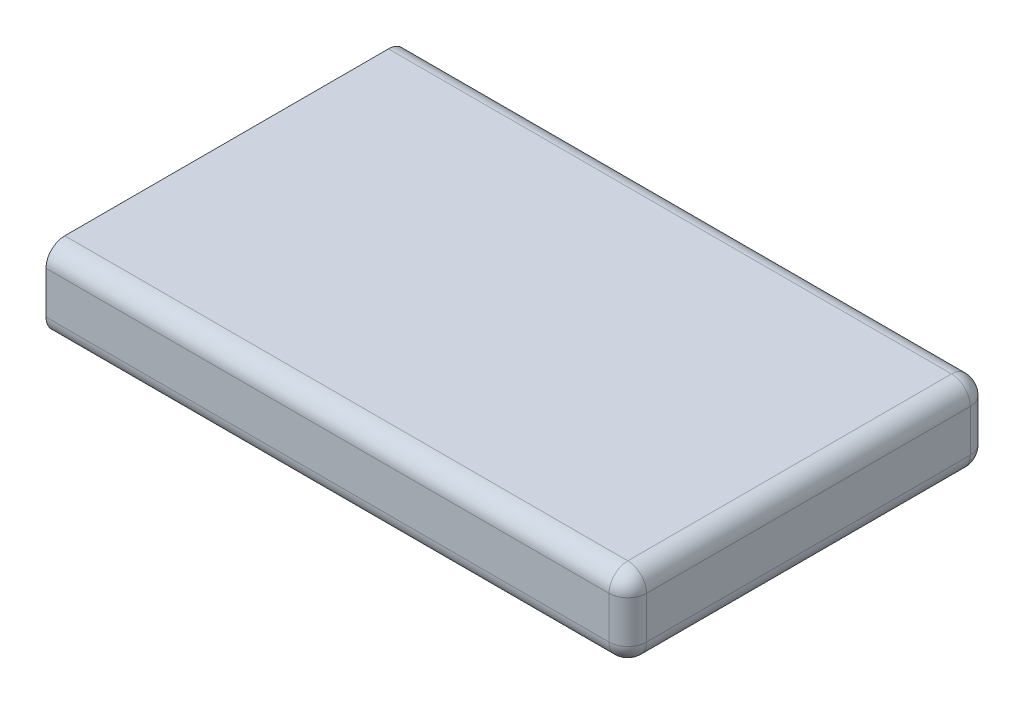
ISO-10303-21;
HEADER;
FILE_DESCRIPTION(('STEP AP214'),'2;1');
FILE_NAME('part.step','',(''),(''),'','','');
FILE_SCHEMA(('AUTOMOTIVE_DESIGN { 1 0 10303 214 1 1 1 1 }'));
ENDSEC;
DATA;
#1=APPLICATION_CONTEXT('core data for automotive mechanical design processes');
#2=APPLICATION_PROTOCOL_DEFINITION('international standard','automotive_design',2000,#1);
#3=PRODUCT_CONTEXT('',#1,'mechanical');
#4=PRODUCT('Part','Part','',(#3));
#5=PRODUCT_RELATED_PRODUCT_CATEGORY('part','',(#4));
#6=PRODUCT_DEFINITION_FORMATION('','',#4);
#7=PRODUCT_DEFINITION_CONTEXT('part definition',#1,'design');
#8=PRODUCT_DEFINITION('design','',#6,#7);
#9=PRODUCT_DEFINITION_SHAPE('','',#8);
#10=(LENGTH_UNIT() NAMED_UNIT(*) SI_UNIT(.MILLI.,.METRE.));
#11=(NAMED_UNIT(*) PLANE_ANGLE_UNIT() SI_UNIT($,.RADIAN.));
#12=(NAMED_UNIT(*) SI_UNIT($,.STERADIAN.) SOLID_ANGLE_UNIT());
#13=UNCERTAINTY_MEASURE_WITH_UNIT(LENGTH_MEASURE(1.E-05),#10,'distance_accuracy_value','');
#14=(GEOMETRIC_REPRESENTATION_CONTEXT(3) GLOBAL_UNCERTAINTY_ASSIGNED_CONTEXT((#13)) GLOBAL_UNIT_ASSIGNED_CONTEXT((#10,
#11,#12)) REPRESENTATION_CONTEXT('',''));
#15=CARTESIAN_POINT('',(0.,0.,0.));
#16=DIRECTION('',(0.,0.,1.));
#17=DIRECTION('',(1.,0.,0.));
#18=AXIS2_PLACEMENT_3D('',#15,#16,#17);
#19=CARTESIAN_POINT('',(0.,8.5,0.));
#20=DIRECTION('',(1.,0.,0.));
#21=DIRECTION('',(0.,0.,-1.));
#22=AXIS2_PLACEMENT_3D('',#19,#20,#21);
#23=PLANE('',#22);
#24=DIRECTION('',(0.,-1.,0.));
#25=VECTOR('',#24,1.);
#26=CARTESIAN_POINT('',(0.,8.5,0.));
#27=LINE('',#26,#25);
#28=CARTESIAN_POINT('',(0.,6.5,0.));
#29=VERTEX_POINT('',#28);
#30=CARTESIAN_POINT('',(0.,2.,0.));
#31=VERTEX_POINT('',#30);
#32=EDGE_CURVE('E114',#29,#31,#27,.T.);
#33=ORIENTED_EDGE('',*,*,#32,.T.);
#34=CARTESIAN_POINT('',(0.,2.,2.));
#35=DIRECTION('',(1.,0.,0.));
#36=DIRECTION('',(0.,0.,-1.));
#37=AXIS2_PLACEMENT_3D('',#34,#35,#36);
#38=CIRCLE('',#37,2.);
#39=CARTESIAN_POINT('',(0.,0.,2.));
#40=VERTEX_POINT('',#39);
#41=EDGE_CURVE('E120',#31,#40,#38,.F.);
#42=ORIENTED_EDGE('',*,*,#41,.T.);
#43=DIRECTION('',(0.,0.,1.));
#44=VECTOR('',#43,1.);
#45=CARTESIAN_POINT('',(0.,0.,0.));
#46=LINE('',#45,#44);
#47=CARTESIAN_POINT('',(0.,0.,36.5));
#48=VERTEX_POINT('',#47);
#49=EDGE_CURVE('E202',#40,#48,#46,.T.);
#50=ORIENTED_EDGE('',*,*,#49,.T.);
#51=CARTESIAN_POINT('',(0.,2.,36.5));
#52=DIRECTION('',(1.,0.,0.));
#53=DIRECTION('',(0.,0.,-1.));
#54=AXIS2_PLACEMENT_3D('',#51,#52,#53);
#55=CIRCLE('',#54,2.);
#56=CARTESIAN_POINT('',(0.,2.,38.5));
#57=VERTEX_POINT('',#56);
#58=EDGE_CURVE('E121',#48,#57,#55,.F.);
#59=ORIENTED_EDGE('',*,*,#58,.T.);
#60=DIRECTION('',(0.,-1.,0.));
#61=VECTOR('',#60,1.);
#62=CARTESIAN_POINT('',(0.,8.5,38.5));
#63=LINE('',#62,#61);
#64=CARTESIAN_POINT('',(0.,6.5,38.5));
#65=VERTEX_POINT('',#64);
#66=EDGE_CURVE('E130',#65,#57,#63,.T.);
#67=ORIENTED_EDGE('',*,*,#66,.F.);
#68=CARTESIAN_POINT('',(0.,6.5,36.5));
#69=DIRECTION('',(1.,0.,0.));
#70=DIRECTION('',(0.,0.,-1.));
#71=AXIS2_PLACEMENT_3D('',#68,#69,#70);
#72=CIRCLE('',#71,2.);
#73=CARTESIAN_POINT('',(0.,8.5,36.5));
#74=VERTEX_POINT('',#73);
#75=EDGE_CURVE('E138',#65,#74,#72,.F.);
#76=ORIENTED_EDGE('',*,*,#75,.T.);
#77=DIRECTION('',(0.,0.,1.));
#78=VECTOR('',#77,1.);
#79=CARTESIAN_POINT('',(0.,8.5,0.));
#80=LINE('',#79,#78);
#81=CARTESIAN_POINT('',(0.,8.5,2.));
#82=VERTEX_POINT('',#81);
#83=EDGE_CURVE('E116',#82,#74,#80,.T.);
#84=ORIENTED_EDGE('',*,*,#83,.F.);
#85=CARTESIAN_POINT('',(0.,6.5,2.));
#86=DIRECTION('',(1.,0.,0.));
#87=DIRECTION('',(0.,0.,-1.));
#88=AXIS2_PLACEMENT_3D('',#85,#86,#87);
#89=CIRCLE('',#88,2.);
#90=EDGE_CURVE('E112',#82,#29,#89,.F.);
#91=ORIENTED_EDGE('',*,*,#90,.T.);
#92=EDGE_LOOP('',(#33,#42,#50,#59,#67,#76,#84,#91));
#93=FACE_BOUND('',#92,.T.);
#94=ADVANCED_FACE('F36',(#93),#23,.F.);
#95=CARTESIAN_POINT('',(0.,8.5,38.5));
#96=DIRECTION('',(0.,0.,-1.));
#97=DIRECTION('',(-1.,0.,0.));
#98=AXIS2_PLACEMENT_3D('',#95,#96,#97);
#99=PLANE('',#98);
#100=ORIENTED_EDGE('',*,*,#66,.T.);
#101=DIRECTION('',(1.,0.,0.));
#102=VECTOR('',#101,1.);
#103=CARTESIAN_POINT('',(0.,2.,38.5));
#104=LINE('',#103,#102);
#105=CARTESIAN_POINT('',(60.,2.,38.5));
#106=VERTEX_POINT('',#105);
#107=EDGE_CURVE('E11',#57,#106,#104,.T.);
#108=ORIENTED_EDGE('',*,*,#107,.T.);
#109=DIRECTION('',(0.,-1.,0.));
#110=VECTOR('',#109,1.);
#111=CARTESIAN_POINT('',(60.,8.5,38.5));
#112=LINE('',#111,#110);
#113=CARTESIAN_POINT('',(60.,6.5,38.5));
#114=VERTEX_POINT('',#113);
#115=EDGE_CURVE('E45',#106,#114,#112,.F.);
#116=ORIENTED_EDGE('',*,*,#115,.T.);
#117=DIRECTION('',(1.,0.,0.));
#118=VECTOR('',#117,1.);
#119=CARTESIAN_POINT('',(0.,6.5,38.5));
#120=LINE('',#119,#118);
#121=EDGE_CURVE('E167',#114,#65,#120,.F.);
#122=ORIENTED_EDGE('',*,*,#121,.T.);
#123=EDGE_LOOP('',(#100,#108,#116,#122));
#124=FACE_BOUND('',#123,.T.);
#125=ADVANCED_FACE('F212',(#124),#99,.F.);
#126=CARTESIAN_POINT('',(62.,8.5,0.));
#127=DIRECTION('',(-1.,0.,0.));
#128=DIRECTION('',(0.,0.,1.));
#129=AXIS2_PLACEMENT_3D('',#126,#127,#128);
#130=PLANE('',#129);
#131=DIRECTION('',(0.,-1.,0.));
#132=VECTOR('',#131,1.);
#133=CARTESIAN_POINT('',(62.,8.5,36.5));
#134=LINE('',#133,#132);
#135=CARTESIAN_POINT('',(62.,6.5,36.5));
#136=VERTEX_POINT('',#135);
#137=CARTESIAN_POINT('',(62.,2.,36.5));
#138=VERTEX_POINT('',#137);
#139=EDGE_CURVE('E160',#136,#138,#134,.T.);
#140=ORIENTED_EDGE('',*,*,#139,.T.);
#141=DIRECTION('',(0.,0.,-1.));
#142=VECTOR('',#141,1.);
#143=CARTESIAN_POINT('',(62.,2.,0.));
#144=LINE('',#143,#142);
#145=CARTESIAN_POINT('',(62.,2.,2.));
#146=VERTEX_POINT('',#145);
#147=EDGE_CURVE('E165',#138,#146,#144,.T.);
#148=ORIENTED_EDGE('',*,*,#147,.T.);
#149=DIRECTION('',(0.,-1.,0.));
#150=VECTOR('',#149,1.);
#151=CARTESIAN_POINT('',(62.,8.5,2.));
#152=LINE('',#151,#150);
#153=CARTESIAN_POINT('',(62.,6.5,2.));
#154=VERTEX_POINT('',#153);
#155=EDGE_CURVE('E162',#146,#154,#152,.F.);
#156=ORIENTED_EDGE('',*,*,#155,.T.);
#157=DIRECTION('',(0.,0.,-1.));
#158=VECTOR('',#157,1.);
#159=CARTESIAN_POINT('',(62.,6.5,38.5));
#160=LINE('',#159,#158);
#161=EDGE_CURVE('E158',#154,#136,#160,.F.);
#162=ORIENTED_EDGE('',*,*,#161,.T.);
#163=EDGE_LOOP('',(#140,#148,#156,#162));
#164=FACE_BOUND('',#163,.T.);
#165=ADVANCED_FACE('F225',(#164),#130,.F.);
#166=CARTESIAN_POINT('',(0.,8.5,0.));
#167=DIRECTION('',(0.,0.,1.));
#168=DIRECTION('',(1.,0.,0.));
#169=AXIS2_PLACEMENT_3D('',#166,#167,#168);
#170=PLANE('',#169);
#171=DIRECTION('',(0.,-1.,0.));
#172=VECTOR('',#171,1.);
#173=CARTESIAN_POINT('',(60.,8.5,0.));
#174=LINE('',#173,#172);
#175=CARTESIAN_POINT('',(60.,6.5,0.));
#176=VERTEX_POINT('',#175);
#177=CARTESIAN_POINT('',(60.,2.,0.));
#178=VERTEX_POINT('',#177);
#179=EDGE_CURVE('E136',#176,#178,#174,.T.);
#180=ORIENTED_EDGE('',*,*,#179,.T.);
#181=DIRECTION('',(-1.,0.,0.));
#182=VECTOR('',#181,1.);
#183=CARTESIAN_POINT('',(0.,2.,0.));
#184=LINE('',#183,#182);
#185=EDGE_CURVE('E129',#178,#31,#184,.T.);
#186=ORIENTED_EDGE('',*,*,#185,.T.);
#187=ORIENTED_EDGE('',*,*,#32,.F.);
#188=DIRECTION('',(-1.,0.,0.));
#189=VECTOR('',#188,1.);
#190=CARTESIAN_POINT('',(62.,6.5,0.));
#191=LINE('',#190,#189);
#192=EDGE_CURVE('E126',#29,#176,#191,.F.);
#193=ORIENTED_EDGE('',*,*,#192,.T.);
#194=EDGE_LOOP('',(#180,#186,#187,#193));
#195=FACE_BOUND('',#194,.T.);
#196=ADVANCED_FACE('F125',(#195),#170,.F.);
#197=CARTESIAN_POINT('',(0.,8.5,0.));
#198=DIRECTION('',(0.,1.,0.));
#199=DIRECTION('',(0.,0.,1.));
#200=AXIS2_PLACEMENT_3D('',#197,#198,#199);
#201=PLANE('',#200);
#202=DIRECTION('',(0.,0.,-1.));
#203=VECTOR('',#202,1.);
#204=CARTESIAN_POINT('',(60.,8.5,0.));
#205=LINE('',#204,#203);
#206=CARTESIAN_POINT('',(60.,8.5,36.5));
#207=VERTEX_POINT('',#206);
#208=CARTESIAN_POINT('',(60.,8.5,2.));
#209=VERTEX_POINT('',#208);
#210=EDGE_CURVE('E154',#207,#209,#205,.T.);
#211=ORIENTED_EDGE('',*,*,#210,.T.);
#212=DIRECTION('',(-1.,0.,0.));
#213=VECTOR('',#212,1.);
#214=CARTESIAN_POINT('',(0.,8.5,2.));
#215=LINE('',#214,#213);
#216=EDGE_CURVE('E156',#209,#82,#215,.T.);
#217=ORIENTED_EDGE('',*,*,#216,.T.);
#218=ORIENTED_EDGE('',*,*,#83,.T.);
#219=DIRECTION('',(1.,0.,0.));
#220=VECTOR('',#219,1.);
#221=CARTESIAN_POINT('',(62.,8.5,36.5));
#222=LINE('',#221,#220);
#223=EDGE_CURVE('E152',#74,#207,#222,.T.);
#224=ORIENTED_EDGE('',*,*,#223,.T.);
#225=EDGE_LOOP('',(#211,#217,#218,#224));
#226=FACE_BOUND('',#225,.T.);
#227=ADVANCED_FACE('F351',(#226),#201,.T.);
#228=CARTESIAN_POINT('',(0.,0.,0.));
#229=DIRECTION('',(0.,1.,0.));
#230=DIRECTION('',(0.,0.,1.));
#231=AXIS2_PLACEMENT_3D('',#228,#229,#230);
#232=PLANE('',#231);
#233=ORIENTED_EDGE('',*,*,#49,.F.);
#234=DIRECTION('',(-1.,0.,0.));
#235=VECTOR('',#234,1.);
#236=CARTESIAN_POINT('',(0.,0.,2.));
#237=LINE('',#236,#235);
#238=CARTESIAN_POINT('',(60.,0.,2.));
#239=VERTEX_POINT('',#238);
#240=EDGE_CURVE('E150',#40,#239,#237,.F.);
#241=ORIENTED_EDGE('',*,*,#240,.T.);
#242=DIRECTION('',(0.,0.,-1.));
#243=VECTOR('',#242,1.);
#244=CARTESIAN_POINT('',(60.,0.,0.));
#245=LINE('',#244,#243);
#246=CARTESIAN_POINT('',(60.,0.,36.5));
#247=VERTEX_POINT('',#246);
#248=EDGE_CURVE('E148',#239,#247,#245,.F.);
#249=ORIENTED_EDGE('',*,*,#248,.T.);
#250=DIRECTION('',(1.,0.,0.));
#251=VECTOR('',#250,1.);
#252=CARTESIAN_POINT('',(0.,0.,36.5));
#253=LINE('',#252,#251);
#254=EDGE_CURVE('E146',#247,#48,#253,.F.);
#255=ORIENTED_EDGE('',*,*,#254,.T.);
#256=EDGE_LOOP('',(#233,#241,#249,#255));
#257=FACE_BOUND('',#256,.T.);
#258=ADVANCED_FACE('F239',(#257),#232,.F.);
#259=CARTESIAN_POINT('',(0.,6.5,36.5));
#260=DIRECTION('',(-1.,0.,0.));
#261=DIRECTION('',(0.,0.,1.));
#262=AXIS2_PLACEMENT_3D('',#259,#260,#261);
#263=CYLINDRICAL_SURFACE('',#262,2.);
#264=CARTESIAN_POINT('',(60.,6.5,36.5));
#265=DIRECTION('',(1.,0.,0.));
#266=DIRECTION('',(0.,0.,-1.));
#267=AXIS2_PLACEMENT_3D('',#264,#265,#266);
#268=CIRCLE('',#267,2.);
#269=EDGE_CURVE('E40',#207,#114,#268,.T.);
#270=ORIENTED_EDGE('',*,*,#269,.F.);
#271=ORIENTED_EDGE('',*,*,#223,.F.);
#272=ORIENTED_EDGE('',*,*,#75,.F.);
#273=ORIENTED_EDGE('',*,*,#121,.F.);
#274=EDGE_LOOP('',(#270,#271,#272,#273));
#275=FACE_BOUND('',#274,.T.);
#276=ADVANCED_FACE('F38',(#275),#263,.T.);
#277=CARTESIAN_POINT('',(60.,6.5,36.5));
#278=DIRECTION('',(0.,0.,1.));
#279=DIRECTION('',(1.,0.,0.));
#280=AXIS2_PLACEMENT_3D('',#277,#278,#279);
#281=SPHERICAL_SURFACE('',#280,2.);
#282=CARTESIAN_POINT('',(60.,6.5,36.5));
#283=DIRECTION('',(0.,0.,1.));
#284=DIRECTION('',(1.,0.,0.));
#285=AXIS2_PLACEMENT_3D('',#282,#283,#284);
#286=CIRCLE('',#285,2.);
#287=EDGE_CURVE('E194',#207,#136,#286,.F.);
#288=ORIENTED_EDGE('',*,*,#287,.F.);
#289=ORIENTED_EDGE('',*,*,#269,.T.);
#290=CARTESIAN_POINT('',(60.,6.5,36.5));
#291=DIRECTION('',(0.,1.,0.));
#292=DIRECTION('',(0.,0.,1.));
#293=AXIS2_PLACEMENT_3D('',#290,#291,#292);
#294=CIRCLE('',#293,2.);
#295=EDGE_CURVE('E196',#136,#114,#294,.F.);
#296=ORIENTED_EDGE('',*,*,#295,.F.);
#297=EDGE_LOOP('',(#288,#289,#296));
#298=FACE_BOUND('',#297,.T.);
#299=ADVANCED_FACE('F232',(#298),#281,.T.);
#300=CARTESIAN_POINT('',(0.,2.,36.5));
#301=DIRECTION('',(1.,0.,0.));
#302=DIRECTION('',(0.,0.,-1.));
#303=AXIS2_PLACEMENT_3D('',#300,#301,#302);
#304=CYLINDRICAL_SURFACE('',#303,2.);
#305=ORIENTED_EDGE('',*,*,#58,.F.);
#306=ORIENTED_EDGE('',*,*,#254,.F.);
#307=CARTESIAN_POINT('',(60.,2.,36.5));
#308=DIRECTION('',(1.,0.,0.));
#309=DIRECTION('',(0.,0.,-1.));
#310=AXIS2_PLACEMENT_3D('',#307,#308,#309);
#311=CIRCLE('',#310,2.);
#312=EDGE_CURVE('E191',#106,#247,#311,.T.);
#313=ORIENTED_EDGE('',*,*,#312,.F.);
#314=ORIENTED_EDGE('',*,*,#107,.F.);
#315=EDGE_LOOP('',(#305,#306,#313,#314));
#316=FACE_BOUND('',#315,.T.);
#317=ADVANCED_FACE('F216',(#316),#304,.T.);
#318=CARTESIAN_POINT('',(60.,8.5,36.5));
#319=DIRECTION('',(0.,-1.,0.));
#320=DIRECTION('',(0.,0.,-1.));
#321=AXIS2_PLACEMENT_3D('',#318,#319,#320);
#322=CYLINDRICAL_SURFACE('',#321,2.);
#323=ORIENTED_EDGE('',*,*,#295,.T.);
#324=ORIENTED_EDGE('',*,*,#115,.F.);
#325=CARTESIAN_POINT('',(60.,2.,36.5));
#326=DIRECTION('',(0.,-1.,0.));
#327=DIRECTION('',(0.,0.,-1.));
#328=AXIS2_PLACEMENT_3D('',#325,#326,#327);
#329=CIRCLE('',#328,2.);
#330=EDGE_CURVE('E188',#138,#106,#329,.T.);
#331=ORIENTED_EDGE('',*,*,#330,.F.);
#332=ORIENTED_EDGE('',*,*,#139,.F.);
#333=EDGE_LOOP('',(#323,#324,#331,#332));
#334=FACE_BOUND('',#333,.T.);
#335=ADVANCED_FACE('F223',(#334),#322,.T.);
#336=CARTESIAN_POINT('',(60.,6.5,0.));
#337=DIRECTION('',(0.,0.,1.));
#338=DIRECTION('',(1.,0.,0.));
#339=AXIS2_PLACEMENT_3D('',#336,#337,#338);
#340=CYLINDRICAL_SURFACE('',#339,2.);
#341=ORIENTED_EDGE('',*,*,#287,.T.);
#342=ORIENTED_EDGE('',*,*,#161,.F.);
#343=CARTESIAN_POINT('',(60.,6.5,2.));
#344=DIRECTION('',(0.,0.,-1.));
#345=DIRECTION('',(-1.,0.,0.));
#346=AXIS2_PLACEMENT_3D('',#343,#344,#345);
#347=CIRCLE('',#346,2.);
#348=EDGE_CURVE('E185',#209,#154,#347,.T.);
#349=ORIENTED_EDGE('',*,*,#348,.F.);
#350=ORIENTED_EDGE('',*,*,#210,.F.);
#351=EDGE_LOOP('',(#341,#342,#349,#350));
#352=FACE_BOUND('',#351,.T.);
#353=ADVANCED_FACE('F231',(#352),#340,.T.);
#354=CARTESIAN_POINT('',(0.,6.5,2.));
#355=DIRECTION('',(1.,0.,0.));
#356=DIRECTION('',(0.,0.,-1.));
#357=AXIS2_PLACEMENT_3D('',#354,#355,#356);
#358=CYLINDRICAL_SURFACE('',#357,2.);
#359=ORIENTED_EDGE('',*,*,#90,.F.);
#360=ORIENTED_EDGE('',*,*,#216,.F.);
#361=CARTESIAN_POINT('',(60.,6.5,2.));
#362=DIRECTION('',(1.,0.,0.));
#363=DIRECTION('',(0.,0.,-1.));
#364=AXIS2_PLACEMENT_3D('',#361,#362,#363);
#365=CIRCLE('',#364,2.);
#366=EDGE_CURVE('E134',#176,#209,#365,.T.);
#367=ORIENTED_EDGE('',*,*,#366,.F.);
#368=ORIENTED_EDGE('',*,*,#192,.F.);
#369=EDGE_LOOP('',(#359,#360,#367,#368));
#370=FACE_BOUND('',#369,.T.);
#371=ADVANCED_FACE('F132',(#370),#358,.T.);
#372=CARTESIAN_POINT('',(60.,2.,36.5));
#373=DIRECTION('',(0.,0.,1.));
#374=DIRECTION('',(1.,0.,0.));
#375=AXIS2_PLACEMENT_3D('',#372,#373,#374);
#376=SPHERICAL_SURFACE('',#375,2.);
#377=ORIENTED_EDGE('',*,*,#330,.T.);
#378=ORIENTED_EDGE('',*,*,#312,.T.);
#379=CARTESIAN_POINT('',(60.,2.,36.5));
#380=DIRECTION('',(0.,0.,1.));
#381=DIRECTION('',(1.,0.,0.));
#382=AXIS2_PLACEMENT_3D('',#379,#380,#381);
#383=CIRCLE('',#382,2.);
#384=EDGE_CURVE('E181',#138,#247,#383,.F.);
#385=ORIENTED_EDGE('',*,*,#384,.F.);
#386=EDGE_LOOP('',(#377,#378,#385));
#387=FACE_BOUND('',#386,.T.);
#388=ADVANCED_FACE('F221',(#387),#376,.T.);
#389=CARTESIAN_POINT('',(60.,6.5,2.));
#390=DIRECTION('',(0.,1.,0.));
#391=DIRECTION('',(0.,0.,1.));
#392=AXIS2_PLACEMENT_3D('',#389,#390,#391);
#393=SPHERICAL_SURFACE('',#392,2.);
#394=ORIENTED_EDGE('',*,*,#366,.T.);
#395=ORIENTED_EDGE('',*,*,#348,.T.);
#396=CARTESIAN_POINT('',(60.,6.5,2.));
#397=DIRECTION('',(0.,1.,0.));
#398=DIRECTION('',(0.,0.,1.));
#399=AXIS2_PLACEMENT_3D('',#396,#397,#398);
#400=CIRCLE('',#399,2.);
#401=EDGE_CURVE('E179',#176,#154,#400,.F.);
#402=ORIENTED_EDGE('',*,*,#401,.F.);
#403=EDGE_LOOP('',(#394,#395,#402));
#404=FACE_BOUND('',#403,.T.);
#405=ADVANCED_FACE('F264',(#404),#393,.T.);
#406=CARTESIAN_POINT('',(60.,2.,0.));
#407=DIRECTION('',(0.,0.,-1.));
#408=DIRECTION('',(-1.,0.,0.));
#409=AXIS2_PLACEMENT_3D('',#406,#407,#408);
#410=CYLINDRICAL_SURFACE('',#409,2.);
#411=ORIENTED_EDGE('',*,*,#384,.T.);
#412=ORIENTED_EDGE('',*,*,#248,.F.);
#413=CARTESIAN_POINT('',(60.,2.,2.));
#414=DIRECTION('',(0.,0.,-1.));
#415=DIRECTION('',(-1.,0.,0.));
#416=AXIS2_PLACEMENT_3D('',#413,#414,#415);
#417=CIRCLE('',#416,2.);
#418=EDGE_CURVE('E176',#146,#239,#417,.T.);
#419=ORIENTED_EDGE('',*,*,#418,.F.);
#420=ORIENTED_EDGE('',*,*,#147,.F.);
#421=EDGE_LOOP('',(#411,#412,#419,#420));
#422=FACE_BOUND('',#421,.T.);
#423=ADVANCED_FACE('F260',(#422),#410,.T.);
#424=CARTESIAN_POINT('',(60.,8.5,2.));
#425=DIRECTION('',(0.,-1.,0.));
#426=DIRECTION('',(0.,0.,-1.));
#427=AXIS2_PLACEMENT_3D('',#424,#425,#426);
#428=CYLINDRICAL_SURFACE('',#427,2.);
#429=ORIENTED_EDGE('',*,*,#401,.T.);
#430=ORIENTED_EDGE('',*,*,#155,.F.);
#431=CARTESIAN_POINT('',(60.,2.,2.));
#432=DIRECTION('',(0.,-1.,0.));
#433=DIRECTION('',(0.,0.,-1.));
#434=AXIS2_PLACEMENT_3D('',#431,#432,#433);
#435=CIRCLE('',#434,2.);
#436=EDGE_CURVE('E173',#178,#146,#435,.T.);
#437=ORIENTED_EDGE('',*,*,#436,.F.);
#438=ORIENTED_EDGE('',*,*,#179,.F.);
#439=EDGE_LOOP('',(#429,#430,#437,#438));
#440=FACE_BOUND('',#439,.T.);
#441=ADVANCED_FACE('F256',(#440),#428,.T.);
#442=CARTESIAN_POINT('',(60.,2.,2.));
#443=DIRECTION('',(1.,0.,0.));
#444=DIRECTION('',(0.,0.,-1.));
#445=AXIS2_PLACEMENT_3D('',#442,#443,#444);
#446=SPHERICAL_SURFACE('',#445,2.);
#447=ORIENTED_EDGE('',*,*,#436,.T.);
#448=ORIENTED_EDGE('',*,*,#418,.T.);
#449=CARTESIAN_POINT('',(60.,2.,2.));
#450=DIRECTION('',(1.,0.,0.));
#451=DIRECTION('',(0.,0.,-1.));
#452=AXIS2_PLACEMENT_3D('',#449,#450,#451);
#453=CIRCLE('',#452,2.);
#454=EDGE_CURVE('E170',#178,#239,#453,.F.);
#455=ORIENTED_EDGE('',*,*,#454,.F.);
#456=EDGE_LOOP('',(#447,#448,#455));
#457=FACE_BOUND('',#456,.T.);
#458=ADVANCED_FACE('F252',(#457),#446,.T.);
#459=CARTESIAN_POINT('',(0.,2.,2.));
#460=DIRECTION('',(-1.,0.,0.));
#461=DIRECTION('',(0.,0.,1.));
#462=AXIS2_PLACEMENT_3D('',#459,#460,#461);
#463=CYLINDRICAL_SURFACE('',#462,2.);
#464=ORIENTED_EDGE('',*,*,#454,.T.);
#465=ORIENTED_EDGE('',*,*,#240,.F.);
#466=ORIENTED_EDGE('',*,*,#41,.F.);
#467=ORIENTED_EDGE('',*,*,#185,.F.);
#468=EDGE_LOOP('',(#464,#465,#466,#467));
#469=FACE_BOUND('',#468,.T.);
#470=ADVANCED_FACE('F249',(#469),#463,.T.);
#471=CLOSED_SHELL('',(#94,#125,#165,#196,#227,#258,#276,#299,#317,#335,#353,#371,#388,#405,#423,
#441,#458,#470));
#472=MANIFOLD_SOLID_BREP('B2',#471);
#473=ADVANCED_BREP_SHAPE_REPRESENTATION('',(#18,#472),#14);
#474=SHAPE_DEFINITION_REPRESENTATION(#9,#473);
ENDSEC;
END-ISO-10303-21;
